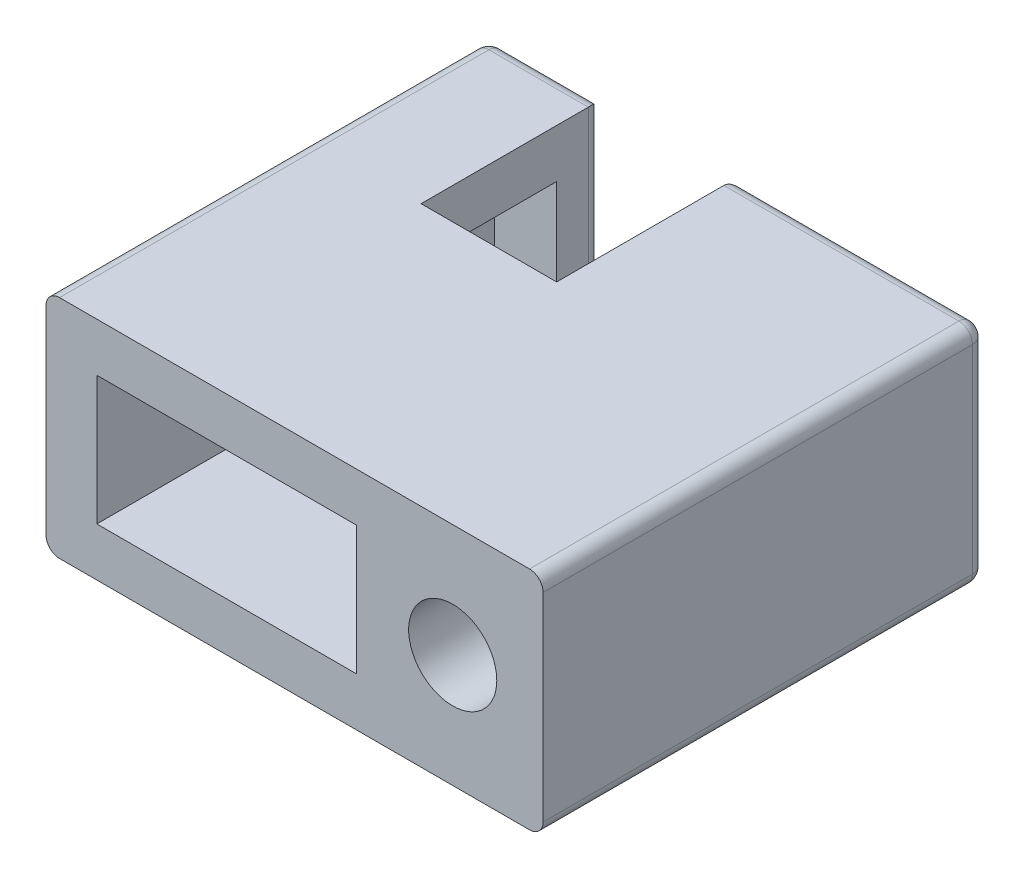
ISO-10303-21;
HEADER;
FILE_DESCRIPTION(('STEP AP214'),'2;1');
FILE_NAME('part.step','',(''),(''),'','','');
FILE_SCHEMA(('AUTOMOTIVE_DESIGN { 1 0 10303 214 1 1 1 1 }'));
ENDSEC;
DATA;
#1=APPLICATION_CONTEXT('core data for automotive mechanical design processes');
#2=APPLICATION_PROTOCOL_DEFINITION('international standard','automotive_design',2000,#1);
#3=PRODUCT_CONTEXT('',#1,'mechanical');
#4=PRODUCT('Part','Part','',(#3));
#5=PRODUCT_RELATED_PRODUCT_CATEGORY('part','',(#4));
#6=PRODUCT_DEFINITION_FORMATION('','',#4);
#7=PRODUCT_DEFINITION_CONTEXT('part definition',#1,'design');
#8=PRODUCT_DEFINITION('design','',#6,#7);
#9=PRODUCT_DEFINITION_SHAPE('','',#8);
#10=(LENGTH_UNIT() NAMED_UNIT(*) SI_UNIT(.MILLI.,.METRE.));
#11=(NAMED_UNIT(*) PLANE_ANGLE_UNIT() SI_UNIT($,.RADIAN.));
#12=(NAMED_UNIT(*) SI_UNIT($,.STERADIAN.) SOLID_ANGLE_UNIT());
#13=UNCERTAINTY_MEASURE_WITH_UNIT(LENGTH_MEASURE(1.E-05),#10,'distance_accuracy_value','');
#14=(GEOMETRIC_REPRESENTATION_CONTEXT(3) GLOBAL_UNCERTAINTY_ASSIGNED_CONTEXT((#13)) GLOBAL_UNIT_ASSIGNED_CONTEXT((#10,
#11,#12)) REPRESENTATION_CONTEXT('',''));
#15=CARTESIAN_POINT('',(0.,0.,0.));
#16=DIRECTION('',(0.,0.,1.));
#17=DIRECTION('',(1.,0.,0.));
#18=AXIS2_PLACEMENT_3D('',#15,#16,#17);
#19=CARTESIAN_POINT('',(1.5,-2.65,-5.8));
#20=DIRECTION('',(0.,0.,1.));
#21=DIRECTION('',(-1.,0.,0.));
#22=AXIS2_PLACEMENT_3D('',#19,#20,#21);
#23=PLANE('',#22);
#24=DIRECTION('',(1.,0.,0.));
#25=VECTOR('',#24,1.);
#26=CARTESIAN_POINT('',(1.5,0.874999999999999,-5.8));
#27=LINE('',#26,#25);
#28=CARTESIAN_POINT('',(-3.7,0.874999999999999,-5.8));
#29=VERTEX_POINT('',#28);
#30=CARTESIAN_POINT('',(-1.8,0.874999999999999,-5.8));
#31=VERTEX_POINT('',#30);
#32=EDGE_CURVE('E330',#29,#31,#27,.T.);
#33=ORIENTED_EDGE('',*,*,#32,.T.);
#34=DIRECTION('',(0.,-1.,0.));
#35=VECTOR('',#34,1.);
#36=CARTESIAN_POINT('',(-1.8,-2.65,-5.8));
#37=LINE('',#36,#35);
#38=CARTESIAN_POINT('',(-1.8,-3.525,-5.8));
#39=VERTEX_POINT('',#38);
#40=EDGE_CURVE('E332',#31,#39,#37,.T.);
#41=ORIENTED_EDGE('',*,*,#40,.T.);
#42=DIRECTION('',(-1.,0.,0.));
#43=VECTOR('',#42,1.);
#44=CARTESIAN_POINT('',(1.5,-3.525,-5.8));
#45=LINE('',#44,#43);
#46=CARTESIAN_POINT('',(-3.7,-3.525,-5.8));
#47=VERTEX_POINT('',#46);
#48=EDGE_CURVE('E326',#39,#47,#45,.T.);
#49=ORIENTED_EDGE('',*,*,#48,.T.);
#50=DIRECTION('',(0.,1.,0.));
#51=VECTOR('',#50,1.);
#52=CARTESIAN_POINT('',(-3.7,-2.65,-5.8));
#53=LINE('',#52,#51);
#54=EDGE_CURVE('E328',#47,#29,#53,.T.);
#55=ORIENTED_EDGE('',*,*,#54,.T.);
#56=EDGE_LOOP('',(#33,#41,#49,#55));
#57=FACE_BOUND('',#56,.T.);
#58=ADVANCED_FACE('F35',(#57),#23,.F.);
#59=CARTESIAN_POINT('',(0.,0.,4.));
#60=DIRECTION('',(0.,0.,1.));
#61=DIRECTION('',(1.,0.,0.));
#62=AXIS2_PLACEMENT_3D('',#59,#60,#61);
#63=PLANE('',#62);
#64=DIRECTION('',(-1.,0.,0.));
#65=VECTOR('',#64,1.);
#66=CARTESIAN_POINT('',(2.875,0.1,4.));
#67=LINE('',#66,#65);
#68=CARTESIAN_POINT('',(2.875,0.1,4.));
#69=VERTEX_POINT('',#68);
#70=CARTESIAN_POINT('',(-2.875,0.099999999999999,4.));
#71=VERTEX_POINT('',#70);
#72=EDGE_CURVE('E236',#69,#71,#67,.T.);
#73=ORIENTED_EDGE('',*,*,#72,.F.);
#74=DIRECTION('',(0.,1.,0.));
#75=VECTOR('',#74,1.);
#76=CARTESIAN_POINT('',(2.875,-2.75,4.));
#77=LINE('',#76,#75);
#78=CARTESIAN_POINT('',(2.875,-2.75,4.));
#79=VERTEX_POINT('',#78);
#80=EDGE_CURVE('E234',#79,#69,#77,.T.);
#81=ORIENTED_EDGE('',*,*,#80,.F.);
#82=DIRECTION('',(1.,0.,0.));
#83=VECTOR('',#82,1.);
#84=CARTESIAN_POINT('',(2.875,-2.75,4.));
#85=LINE('',#84,#83);
#86=CARTESIAN_POINT('',(-2.875,-2.75,4.));
#87=VERTEX_POINT('',#86);
#88=EDGE_CURVE('E241',#87,#79,#85,.T.);
#89=ORIENTED_EDGE('',*,*,#88,.F.);
#90=DIRECTION('',(0.,-1.,0.));
#91=VECTOR('',#90,1.);
#92=CARTESIAN_POINT('',(-2.875,-2.75,4.));
#93=LINE('',#92,#91);
#94=EDGE_CURVE('E238',#71,#87,#93,.T.);
#95=ORIENTED_EDGE('',*,*,#94,.F.);
#96=EDGE_LOOP('',(#73,#81,#89,#95));
#97=FACE_BOUND('',#96,.T.);
#98=DIRECTION('',(0.,1.,0.));
#99=VECTOR('',#98,1.);
#100=CARTESIAN_POINT('',(7.,1.175,4.));
#101=LINE('',#100,#99);
#102=CARTESIAN_POINT('',(7.,-3.525,4.));
#103=VERTEX_POINT('',#102);
#104=CARTESIAN_POINT('',(7.,0.874999999999999,4.));
#105=VERTEX_POINT('',#104);
#106=EDGE_CURVE('E259',#103,#105,#101,.T.);
#107=ORIENTED_EDGE('',*,*,#106,.T.);
#108=CARTESIAN_POINT('',(6.7,0.874999999999999,4.));
#109=DIRECTION('',(0.,0.,1.));
#110=DIRECTION('',(1.,0.,0.));
#111=AXIS2_PLACEMENT_3D('',#108,#109,#110);
#112=CIRCLE('',#111,0.3);
#113=CARTESIAN_POINT('',(6.7,1.175,4.));
#114=VERTEX_POINT('',#113);
#115=EDGE_CURVE('E283',#105,#114,#112,.T.);
#116=ORIENTED_EDGE('',*,*,#115,.T.);
#117=DIRECTION('',(-1.,0.,0.));
#118=VECTOR('',#117,1.);
#119=CARTESIAN_POINT('',(-4.,1.175,4.));
#120=LINE('',#119,#118);
#121=CARTESIAN_POINT('',(-3.7,1.175,4.));
#122=VERTEX_POINT('',#121);
#123=EDGE_CURVE('E262',#114,#122,#120,.T.);
#124=ORIENTED_EDGE('',*,*,#123,.T.);
#125=CARTESIAN_POINT('',(-3.7,0.874999999999999,4.));
#126=DIRECTION('',(0.,0.,1.));
#127=DIRECTION('',(1.,0.,0.));
#128=AXIS2_PLACEMENT_3D('',#125,#126,#127);
#129=CIRCLE('',#128,0.3);
#130=CARTESIAN_POINT('',(-4.,0.874999999999999,4.));
#131=VERTEX_POINT('',#130);
#132=EDGE_CURVE('E277',#122,#131,#129,.T.);
#133=ORIENTED_EDGE('',*,*,#132,.T.);
#134=DIRECTION('',(0.,-1.,0.));
#135=VECTOR('',#134,1.);
#136=CARTESIAN_POINT('',(-4.,1.175,4.));
#137=LINE('',#136,#135);
#138=CARTESIAN_POINT('',(-4.,-3.525,4.));
#139=VERTEX_POINT('',#138);
#140=EDGE_CURVE('E253',#131,#139,#137,.T.);
#141=ORIENTED_EDGE('',*,*,#140,.T.);
#142=CARTESIAN_POINT('',(-3.7,-3.525,4.));
#143=DIRECTION('',(0.,0.,1.));
#144=DIRECTION('',(1.,0.,0.));
#145=AXIS2_PLACEMENT_3D('',#142,#143,#144);
#146=CIRCLE('',#145,0.3);
#147=CARTESIAN_POINT('',(-3.7,-3.825,4.));
#148=VERTEX_POINT('',#147);
#149=EDGE_CURVE('E279',#139,#148,#146,.T.);
#150=ORIENTED_EDGE('',*,*,#149,.T.);
#151=DIRECTION('',(1.,0.,0.));
#152=VECTOR('',#151,1.);
#153=CARTESIAN_POINT('',(-4.,-3.825,4.));
#154=LINE('',#153,#152);
#155=CARTESIAN_POINT('',(6.7,-3.825,4.));
#156=VERTEX_POINT('',#155);
#157=EDGE_CURVE('E256',#148,#156,#154,.T.);
#158=ORIENTED_EDGE('',*,*,#157,.T.);
#159=CARTESIAN_POINT('',(6.7,-3.525,4.));
#160=DIRECTION('',(0.,0.,1.));
#161=DIRECTION('',(1.,0.,0.));
#162=AXIS2_PLACEMENT_3D('',#159,#160,#161);
#163=CIRCLE('',#162,0.3);
#164=EDGE_CURVE('E281',#156,#103,#163,.T.);
#165=ORIENTED_EDGE('',*,*,#164,.T.);
#166=EDGE_LOOP('',(#107,#116,#124,#133,#141,#150,#158,#165));
#167=FACE_BOUND('',#166,.T.);
#168=CARTESIAN_POINT('',(5.,-1.325,4.));
#169=DIRECTION('',(0.,0.,1.));
#170=DIRECTION('',(1.,0.,0.));
#171=AXIS2_PLACEMENT_3D('',#168,#169,#170);
#172=CIRCLE('',#171,0.975);
#173=CARTESIAN_POINT('',(5.975,-1.325,4.));
#174=VERTEX_POINT('',#173);
#175=EDGE_CURVE('E226',#174,#174,#172,.T.);
#176=ORIENTED_EDGE('',*,*,#175,.F.);
#177=EDGE_LOOP('',(#176));
#178=FACE_BOUND('',#177,.T.);
#179=ADVANCED_FACE('F391',(#97,#167,#178),#63,.T.);
#180=CARTESIAN_POINT('',(-4.,1.175,4.));
#181=DIRECTION('',(1.,0.,0.));
#182=DIRECTION('',(0.,0.,-1.));
#183=AXIS2_PLACEMENT_3D('',#180,#181,#182);
#184=PLANE('',#183);
#185=DIRECTION('',(0.,0.,-1.));
#186=VECTOR('',#185,1.);
#187=CARTESIAN_POINT('',(-4.,0.874999999999999,4.));
#188=LINE('',#187,#186);
#189=CARTESIAN_POINT('',(-4.,0.874999999999999,-5.5));
#190=VERTEX_POINT('',#189);
#191=EDGE_CURVE('E290',#131,#190,#188,.T.);
#192=ORIENTED_EDGE('',*,*,#191,.T.);
#193=DIRECTION('',(0.,1.,0.));
#194=VECTOR('',#193,1.);
#195=CARTESIAN_POINT('',(-4.,1.175,-5.5));
#196=LINE('',#195,#194);
#197=CARTESIAN_POINT('',(-4.,-3.525,-5.5));
#198=VERTEX_POINT('',#197);
#199=EDGE_CURVE('E44',#190,#198,#196,.F.);
#200=ORIENTED_EDGE('',*,*,#199,.T.);
#201=DIRECTION('',(0.,0.,-1.));
#202=VECTOR('',#201,1.);
#203=CARTESIAN_POINT('',(-4.,-3.525,4.));
#204=LINE('',#203,#202);
#205=EDGE_CURVE('E292',#198,#139,#204,.F.);
#206=ORIENTED_EDGE('',*,*,#205,.T.);
#207=ORIENTED_EDGE('',*,*,#140,.F.);
#208=EDGE_LOOP('',(#192,#200,#206,#207));
#209=FACE_BOUND('',#208,.T.);
#210=ADVANCED_FACE('F520',(#209),#184,.F.);
#211=CARTESIAN_POINT('',(-4.,-3.825,4.));
#212=DIRECTION('',(0.,1.,0.));
#213=DIRECTION('',(0.,0.,1.));
#214=AXIS2_PLACEMENT_3D('',#211,#212,#213);
#215=PLANE('',#214);
#216=DIRECTION('',(0.,0.,-1.));
#217=VECTOR('',#216,1.);
#218=CARTESIAN_POINT('',(1.5,-3.825,-5.8));
#219=LINE('',#218,#217);
#220=CARTESIAN_POINT('',(1.5,-3.825,-1.8));
#221=VERTEX_POINT('',#220);
#222=CARTESIAN_POINT('',(1.5,-3.825,-5.5));
#223=VERTEX_POINT('',#222);
#224=EDGE_CURVE('E448',#221,#223,#219,.T.);
#225=ORIENTED_EDGE('',*,*,#224,.T.);
#226=DIRECTION('',(-1.,0.,0.));
#227=VECTOR('',#226,1.);
#228=CARTESIAN_POINT('',(-4.,-3.825,-5.5));
#229=LINE('',#228,#227);
#230=CARTESIAN_POINT('',(6.7,-3.825,-5.5));
#231=VERTEX_POINT('',#230);
#232=EDGE_CURVE('E314',#223,#231,#229,.F.);
#233=ORIENTED_EDGE('',*,*,#232,.T.);
#234=DIRECTION('',(0.,0.,-1.));
#235=VECTOR('',#234,1.);
#236=CARTESIAN_POINT('',(6.7,-3.825,4.));
#237=LINE('',#236,#235);
#238=EDGE_CURVE('E288',#231,#156,#237,.F.);
#239=ORIENTED_EDGE('',*,*,#238,.T.);
#240=ORIENTED_EDGE('',*,*,#157,.F.);
#241=DIRECTION('',(0.,0.,-1.));
#242=VECTOR('',#241,1.);
#243=CARTESIAN_POINT('',(-3.7,-3.825,4.));
#244=LINE('',#243,#242);
#245=CARTESIAN_POINT('',(-3.7,-3.825,-5.5));
#246=VERTEX_POINT('',#245);
#247=EDGE_CURVE('E285',#148,#246,#244,.T.);
#248=ORIENTED_EDGE('',*,*,#247,.T.);
#249=DIRECTION('',(-1.,0.,0.));
#250=VECTOR('',#249,1.);
#251=CARTESIAN_POINT('',(-4.,-3.825,-5.5));
#252=LINE('',#251,#250);
#253=CARTESIAN_POINT('',(-1.5,-3.825,-5.5));
#254=VERTEX_POINT('',#253);
#255=EDGE_CURVE('E312',#246,#254,#252,.F.);
#256=ORIENTED_EDGE('',*,*,#255,.T.);
#257=DIRECTION('',(0.,0.,1.));
#258=VECTOR('',#257,1.);
#259=CARTESIAN_POINT('',(-1.5,-3.825,-5.8));
#260=LINE('',#259,#258);
#261=CARTESIAN_POINT('',(-1.5,-3.825,-1.8));
#262=VERTEX_POINT('',#261);
#263=EDGE_CURVE('E442',#254,#262,#260,.T.);
#264=ORIENTED_EDGE('',*,*,#263,.T.);
#265=DIRECTION('',(1.,0.,0.));
#266=VECTOR('',#265,1.);
#267=CARTESIAN_POINT('',(-1.5,-3.825,-1.8));
#268=LINE('',#267,#266);
#269=EDGE_CURVE('E450',#262,#221,#268,.T.);
#270=ORIENTED_EDGE('',*,*,#269,.T.);
#271=EDGE_LOOP('',(#225,#233,#239,#240,#248,#256,#264,#270));
#272=FACE_BOUND('',#271,.T.);
#273=ADVANCED_FACE('F387',(#272),#215,.F.);
#274=CARTESIAN_POINT('',(7.,1.175,4.));
#275=DIRECTION('',(-1.,0.,0.));
#276=DIRECTION('',(0.,0.,1.));
#277=AXIS2_PLACEMENT_3D('',#274,#275,#276);
#278=PLANE('',#277);
#279=DIRECTION('',(0.,0.,-1.));
#280=VECTOR('',#279,1.);
#281=CARTESIAN_POINT('',(7.,-3.525,4.));
#282=LINE('',#281,#280);
#283=CARTESIAN_POINT('',(7.,-3.525,-5.5));
#284=VERTEX_POINT('',#283);
#285=EDGE_CURVE('E272',#103,#284,#282,.T.);
#286=ORIENTED_EDGE('',*,*,#285,.T.);
#287=DIRECTION('',(0.,-1.,0.));
#288=VECTOR('',#287,1.);
#289=CARTESIAN_POINT('',(7.,1.175,-5.5));
#290=LINE('',#289,#288);
#291=CARTESIAN_POINT('',(7.,0.874999999999999,-5.5));
#292=VERTEX_POINT('',#291);
#293=EDGE_CURVE('E318',#284,#292,#290,.F.);
#294=ORIENTED_EDGE('',*,*,#293,.T.);
#295=DIRECTION('',(0.,0.,-1.));
#296=VECTOR('',#295,1.);
#297=CARTESIAN_POINT('',(7.,0.874999999999999,4.));
#298=LINE('',#297,#296);
#299=EDGE_CURVE('E275',#292,#105,#298,.F.);
#300=ORIENTED_EDGE('',*,*,#299,.T.);
#301=ORIENTED_EDGE('',*,*,#106,.F.);
#302=EDGE_LOOP('',(#286,#294,#300,#301));
#303=FACE_BOUND('',#302,.T.);
#304=ADVANCED_FACE('F400',(#303),#278,.F.);
#305=CARTESIAN_POINT('',(-4.,1.175,4.));
#306=DIRECTION('',(0.,-1.,0.));
#307=DIRECTION('',(0.,0.,-1.));
#308=AXIS2_PLACEMENT_3D('',#305,#306,#307);
#309=PLANE('',#308);
#310=DIRECTION('',(0.,0.,-1.));
#311=VECTOR('',#310,1.);
#312=CARTESIAN_POINT('',(6.7,1.175,4.));
#313=LINE('',#312,#311);
#314=CARTESIAN_POINT('',(6.7,1.175,-5.5));
#315=VERTEX_POINT('',#314);
#316=EDGE_CURVE('E269',#114,#315,#313,.T.);
#317=ORIENTED_EDGE('',*,*,#316,.T.);
#318=DIRECTION('',(1.,0.,0.));
#319=VECTOR('',#318,1.);
#320=CARTESIAN_POINT('',(-4.,1.175,-5.5));
#321=LINE('',#320,#319);
#322=CARTESIAN_POINT('',(1.5,1.175,-5.5));
#323=VERTEX_POINT('',#322);
#324=EDGE_CURVE('E324',#315,#323,#321,.F.);
#325=ORIENTED_EDGE('',*,*,#324,.T.);
#326=DIRECTION('',(0.,0.,-1.));
#327=VECTOR('',#326,1.);
#328=CARTESIAN_POINT('',(1.5,1.175,-5.8));
#329=LINE('',#328,#327);
#330=CARTESIAN_POINT('',(1.5,1.175,-1.8));
#331=VERTEX_POINT('',#330);
#332=EDGE_CURVE('E432',#331,#323,#329,.T.);
#333=ORIENTED_EDGE('',*,*,#332,.F.);
#334=DIRECTION('',(1.,0.,0.));
#335=VECTOR('',#334,1.);
#336=CARTESIAN_POINT('',(-1.5,1.175,-1.8));
#337=LINE('',#336,#335);
#338=CARTESIAN_POINT('',(-1.5,1.175,-1.8));
#339=VERTEX_POINT('',#338);
#340=EDGE_CURVE('E443',#339,#331,#337,.T.);
#341=ORIENTED_EDGE('',*,*,#340,.F.);
#342=DIRECTION('',(0.,0.,1.));
#343=VECTOR('',#342,1.);
#344=CARTESIAN_POINT('',(-1.5,1.175,-5.8));
#345=LINE('',#344,#343);
#346=CARTESIAN_POINT('',(-1.5,1.175,-5.5));
#347=VERTEX_POINT('',#346);
#348=EDGE_CURVE('E470',#347,#339,#345,.T.);
#349=ORIENTED_EDGE('',*,*,#348,.F.);
#350=DIRECTION('',(1.,0.,0.));
#351=VECTOR('',#350,1.);
#352=CARTESIAN_POINT('',(-4.,1.175,-5.5));
#353=LINE('',#352,#351);
#354=CARTESIAN_POINT('',(-3.7,1.175,-5.5));
#355=VERTEX_POINT('',#354);
#356=EDGE_CURVE('E322',#347,#355,#353,.F.);
#357=ORIENTED_EDGE('',*,*,#356,.T.);
#358=DIRECTION('',(0.,0.,-1.));
#359=VECTOR('',#358,1.);
#360=CARTESIAN_POINT('',(-3.7,1.175,4.));
#361=LINE('',#360,#359);
#362=EDGE_CURVE('E267',#355,#122,#361,.F.);
#363=ORIENTED_EDGE('',*,*,#362,.T.);
#364=ORIENTED_EDGE('',*,*,#123,.F.);
#365=EDGE_LOOP('',(#317,#325,#333,#341,#349,#357,#363,#364));
#366=FACE_BOUND('',#365,.T.);
#367=ADVANCED_FACE('F430',(#366),#309,.F.);
#368=CARTESIAN_POINT('',(2.875,-2.75,4.));
#369=DIRECTION('',(-1.,0.,0.));
#370=DIRECTION('',(0.,0.,1.));
#371=AXIS2_PLACEMENT_3D('',#368,#369,#370);
#372=PLANE('',#371);
#373=DIRECTION('',(0.,-1.,0.));
#374=VECTOR('',#373,1.);
#375=CARTESIAN_POINT('',(2.875,0.1,-4.8));
#376=LINE('',#375,#374);
#377=CARTESIAN_POINT('',(2.875,0.1,-4.8));
#378=VERTEX_POINT('',#377);
#379=CARTESIAN_POINT('',(2.875,-2.75,-4.8));
#380=VERTEX_POINT('',#379);
#381=EDGE_CURVE('E472',#378,#380,#376,.T.);
#382=ORIENTED_EDGE('',*,*,#381,.T.);
#383=DIRECTION('',(0.,0.,-1.));
#384=VECTOR('',#383,1.);
#385=CARTESIAN_POINT('',(2.875,-2.75,4.));
#386=LINE('',#385,#384);
#387=EDGE_CURVE('E243',#79,#380,#386,.T.);
#388=ORIENTED_EDGE('',*,*,#387,.F.);
#389=ORIENTED_EDGE('',*,*,#80,.T.);
#390=DIRECTION('',(0.,0.,-1.));
#391=VECTOR('',#390,1.);
#392=CARTESIAN_POINT('',(2.875,0.1,4.));
#393=LINE('',#392,#391);
#394=EDGE_CURVE('E250',#69,#378,#393,.T.);
#395=ORIENTED_EDGE('',*,*,#394,.T.);
#396=EDGE_LOOP('',(#382,#388,#389,#395));
#397=FACE_BOUND('',#396,.T.);
#398=ADVANCED_FACE('F498',(#397),#372,.T.);
#399=CARTESIAN_POINT('',(2.875,0.1,4.));
#400=DIRECTION('',(0.,-1.,0.));
#401=DIRECTION('',(1.,0.,0.));
#402=AXIS2_PLACEMENT_3D('',#399,#400,#401);
#403=PLANE('',#402);
#404=DIRECTION('',(1.,0.,0.));
#405=VECTOR('',#404,1.);
#406=CARTESIAN_POINT('',(-2.875,0.099999999999999,-4.8));
#407=LINE('',#406,#405);
#408=CARTESIAN_POINT('',(-2.875,0.099999999999999,-4.8));
#409=VERTEX_POINT('',#408);
#410=CARTESIAN_POINT('',(-1.5,0.099999999999999,-4.8));
#411=VERTEX_POINT('',#410);
#412=EDGE_CURVE('E200',#409,#411,#407,.T.);
#413=ORIENTED_EDGE('',*,*,#412,.T.);
#414=DIRECTION('',(0.,0.,-1.));
#415=VECTOR('',#414,1.);
#416=CARTESIAN_POINT('',(-1.5,0.0999999999999992,4.));
#417=LINE('',#416,#415);
#418=CARTESIAN_POINT('',(-1.5,0.0999999999999994,-1.8));
#419=VERTEX_POINT('',#418);
#420=EDGE_CURVE('E213',#419,#411,#417,.T.);
#421=ORIENTED_EDGE('',*,*,#420,.F.);
#422=DIRECTION('',(-1.,0.,0.));
#423=VECTOR('',#422,1.);
#424=CARTESIAN_POINT('',(2.875,0.1,-1.8));
#425=LINE('',#424,#423);
#426=CARTESIAN_POINT('',(1.5,0.0999999999999994,-1.8));
#427=VERTEX_POINT('',#426);
#428=EDGE_CURVE('E223',#427,#419,#425,.T.);
#429=ORIENTED_EDGE('',*,*,#428,.F.);
#430=DIRECTION('',(0.,0.,1.));
#431=VECTOR('',#430,1.);
#432=CARTESIAN_POINT('',(1.5,0.0999999999999998,4.));
#433=LINE('',#432,#431);
#434=CARTESIAN_POINT('',(1.5,0.1,-4.8));
#435=VERTEX_POINT('',#434);
#436=EDGE_CURVE('E228',#435,#427,#433,.T.);
#437=ORIENTED_EDGE('',*,*,#436,.F.);
#438=DIRECTION('',(1.,0.,0.));
#439=VECTOR('',#438,1.);
#440=CARTESIAN_POINT('',(2.875,0.1,-4.8));
#441=LINE('',#440,#439);
#442=EDGE_CURVE('E490',#435,#378,#441,.T.);
#443=ORIENTED_EDGE('',*,*,#442,.T.);
#444=ORIENTED_EDGE('',*,*,#394,.F.);
#445=ORIENTED_EDGE('',*,*,#72,.T.);
#446=DIRECTION('',(0.,0.,-1.));
#447=VECTOR('',#446,1.);
#448=CARTESIAN_POINT('',(-2.875,0.099999999999999,4.));
#449=LINE('',#448,#447);
#450=EDGE_CURVE('E215',#71,#409,#449,.T.);
#451=ORIENTED_EDGE('',*,*,#450,.T.);
#452=EDGE_LOOP('',(#413,#421,#429,#437,#443,#444,#445,#451));
#453=FACE_BOUND('',#452,.T.);
#454=ADVANCED_FACE('F211',(#453),#403,.T.);
#455=CARTESIAN_POINT('',(-2.875,-2.75,4.));
#456=DIRECTION('',(1.,0.,0.));
#457=DIRECTION('',(0.,0.,-1.));
#458=AXIS2_PLACEMENT_3D('',#455,#456,#457);
#459=PLANE('',#458);
#460=DIRECTION('',(0.,1.,0.));
#461=VECTOR('',#460,1.);
#462=CARTESIAN_POINT('',(-2.875,0.099999999999999,-4.8));
#463=LINE('',#462,#461);
#464=CARTESIAN_POINT('',(-2.875,-2.75,-4.8));
#465=VERTEX_POINT('',#464);
#466=EDGE_CURVE('E488',#465,#409,#463,.T.);
#467=ORIENTED_EDGE('',*,*,#466,.T.);
#468=ORIENTED_EDGE('',*,*,#450,.F.);
#469=ORIENTED_EDGE('',*,*,#94,.T.);
#470=DIRECTION('',(0.,0.,-1.));
#471=VECTOR('',#470,1.);
#472=CARTESIAN_POINT('',(-2.875,-2.75,4.));
#473=LINE('',#472,#471);
#474=EDGE_CURVE('E246',#87,#465,#473,.T.);
#475=ORIENTED_EDGE('',*,*,#474,.T.);
#476=EDGE_LOOP('',(#467,#468,#469,#475));
#477=FACE_BOUND('',#476,.T.);
#478=ADVANCED_FACE('F504',(#477),#459,.T.);
#479=CARTESIAN_POINT('',(2.875,-2.75,4.));
#480=DIRECTION('',(0.,1.,0.));
#481=DIRECTION('',(-1.,0.,0.));
#482=AXIS2_PLACEMENT_3D('',#479,#480,#481);
#483=PLANE('',#482);
#484=DIRECTION('',(-1.,0.,0.));
#485=VECTOR('',#484,1.);
#486=CARTESIAN_POINT('',(-2.875,-2.75,-4.8));
#487=LINE('',#486,#485);
#488=CARTESIAN_POINT('',(-1.5,-2.75,-4.8));
#489=VERTEX_POINT('',#488);
#490=EDGE_CURVE('E203',#489,#465,#487,.T.);
#491=ORIENTED_EDGE('',*,*,#490,.T.);
#492=ORIENTED_EDGE('',*,*,#474,.F.);
#493=ORIENTED_EDGE('',*,*,#88,.T.);
#494=ORIENTED_EDGE('',*,*,#387,.T.);
#495=DIRECTION('',(-1.,0.,0.));
#496=VECTOR('',#495,1.);
#497=CARTESIAN_POINT('',(2.875,-2.75,-4.8));
#498=LINE('',#497,#496);
#499=CARTESIAN_POINT('',(1.5,-2.75,-4.8));
#500=VERTEX_POINT('',#499);
#501=EDGE_CURVE('E484',#380,#500,#498,.T.);
#502=ORIENTED_EDGE('',*,*,#501,.T.);
#503=DIRECTION('',(0.,0.,-1.));
#504=VECTOR('',#503,1.);
#505=CARTESIAN_POINT('',(1.5,-2.75,4.));
#506=LINE('',#505,#504);
#507=CARTESIAN_POINT('',(1.5,-2.75,-1.8));
#508=VERTEX_POINT('',#507);
#509=EDGE_CURVE('E459',#508,#500,#506,.T.);
#510=ORIENTED_EDGE('',*,*,#509,.F.);
#511=DIRECTION('',(1.,0.,0.));
#512=VECTOR('',#511,1.);
#513=CARTESIAN_POINT('',(2.875,-2.75,-1.8));
#514=LINE('',#513,#512);
#515=CARTESIAN_POINT('',(-1.5,-2.75,-1.8));
#516=VERTEX_POINT('',#515);
#517=EDGE_CURVE('E265',#516,#508,#514,.T.);
#518=ORIENTED_EDGE('',*,*,#517,.F.);
#519=DIRECTION('',(0.,0.,1.));
#520=VECTOR('',#519,1.);
#521=CARTESIAN_POINT('',(-1.5,-2.75,4.));
#522=LINE('',#521,#520);
#523=EDGE_CURVE('E224',#489,#516,#522,.T.);
#524=ORIENTED_EDGE('',*,*,#523,.F.);
#525=EDGE_LOOP('',(#491,#492,#493,#494,#502,#510,#518,#524));
#526=FACE_BOUND('',#525,.T.);
#527=ADVANCED_FACE('F483',(#526),#483,.T.);
#528=CARTESIAN_POINT('',(5.,-1.325,4.));
#529=DIRECTION('',(0.,0.,-1.));
#530=DIRECTION('',(-1.,0.,0.));
#531=AXIS2_PLACEMENT_3D('',#528,#529,#530);
#532=CYLINDRICAL_SURFACE('',#531,0.975);
#533=CARTESIAN_POINT('',(5.,-1.325,-5.5));
#534=DIRECTION('',(0.,0.,1.));
#535=DIRECTION('',(1.,0.,0.));
#536=AXIS2_PLACEMENT_3D('',#533,#534,#535);
#537=CIRCLE('',#536,0.975);
#538=CARTESIAN_POINT('',(5.975,-1.325,-5.5));
#539=VERTEX_POINT('',#538);
#540=EDGE_CURVE('E294',#539,#539,#537,.F.);
#541=ORIENTED_EDGE('',*,*,#540,.T.);
#542=EDGE_LOOP('',(#541));
#543=FACE_BOUND('',#542,.T.);
#544=ORIENTED_EDGE('',*,*,#175,.T.);
#545=EDGE_LOOP('',(#544));
#546=FACE_BOUND('',#545,.T.);
#547=ADVANCED_FACE('F511',(#543,#546),#532,.F.);
#548=CARTESIAN_POINT('',(5.,-1.325,-5.8));
#549=DIRECTION('',(0.,0.,1.));
#550=DIRECTION('',(1.,0.,0.));
#551=AXIS2_PLACEMENT_3D('',#548,#549,#550);
#552=CIRCLE('',#551,1.275);
#553=CARTESIAN_POINT('',(6.275,-1.325,-5.8));
#554=VERTEX_POINT('',#553);
#555=EDGE_CURVE('E306',#554,#554,#552,.T.);
#556=ORIENTED_EDGE('',*,*,#555,.T.);
#557=EDGE_LOOP('',(#556));
#558=FACE_BOUND('',#557,.T.);
#559=DIRECTION('',(-1.,0.,0.));
#560=VECTOR('',#559,1.);
#561=CARTESIAN_POINT('',(1.5,-3.525,-5.8));
#562=LINE('',#561,#560);
#563=CARTESIAN_POINT('',(6.7,-3.525,-5.8));
#564=VERTEX_POINT('',#563);
#565=CARTESIAN_POINT('',(1.8,-3.525,-5.8));
#566=VERTEX_POINT('',#565);
#567=EDGE_CURVE('E301',#564,#566,#562,.T.);
#568=ORIENTED_EDGE('',*,*,#567,.T.);
#569=DIRECTION('',(0.,1.,0.));
#570=VECTOR('',#569,1.);
#571=CARTESIAN_POINT('',(1.8,-2.65,-5.8));
#572=LINE('',#571,#570);
#573=CARTESIAN_POINT('',(1.8,0.874999999999999,-5.8));
#574=VERTEX_POINT('',#573);
#575=EDGE_CURVE('E303',#566,#574,#572,.T.);
#576=ORIENTED_EDGE('',*,*,#575,.T.);
#577=DIRECTION('',(1.,0.,0.));
#578=VECTOR('',#577,1.);
#579=CARTESIAN_POINT('',(1.5,0.874999999999999,-5.8));
#580=LINE('',#579,#578);
#581=CARTESIAN_POINT('',(6.7,0.874999999999999,-5.8));
#582=VERTEX_POINT('',#581);
#583=EDGE_CURVE('E297',#574,#582,#580,.T.);
#584=ORIENTED_EDGE('',*,*,#583,.T.);
#585=DIRECTION('',(0.,-1.,0.));
#586=VECTOR('',#585,1.);
#587=CARTESIAN_POINT('',(6.7,-2.65,-5.8));
#588=LINE('',#587,#586);
#589=EDGE_CURVE('E299',#582,#564,#588,.T.);
#590=ORIENTED_EDGE('',*,*,#589,.T.);
#591=EDGE_LOOP('',(#568,#576,#584,#590));
#592=FACE_BOUND('',#591,.T.);
#593=ADVANCED_FACE('F418',(#558,#592),#23,.F.);
#594=CARTESIAN_POINT('',(-1.5,-3.825,-5.8));
#595=DIRECTION('',(-1.,0.,0.));
#596=DIRECTION('',(0.,-1.,0.));
#597=AXIS2_PLACEMENT_3D('',#594,#595,#596);
#598=PLANE('',#597);
#599=ORIENTED_EDGE('',*,*,#263,.F.);
#600=DIRECTION('',(0.,-1.,0.));
#601=VECTOR('',#600,1.);
#602=CARTESIAN_POINT('',(-1.5,-3.825,-5.5));
#603=LINE('',#602,#601);
#604=EDGE_CURVE('E335',#254,#347,#603,.F.);
#605=ORIENTED_EDGE('',*,*,#604,.T.);
#606=ORIENTED_EDGE('',*,*,#348,.T.);
#607=DIRECTION('',(0.,1.,0.));
#608=VECTOR('',#607,1.);
#609=CARTESIAN_POINT('',(-1.5,-3.825,-1.8));
#610=LINE('',#609,#608);
#611=EDGE_CURVE('E222',#419,#339,#610,.T.);
#612=ORIENTED_EDGE('',*,*,#611,.F.);
#613=ORIENTED_EDGE('',*,*,#420,.T.);
#614=DIRECTION('',(0.,-1.,0.));
#615=VECTOR('',#614,1.);
#616=CARTESIAN_POINT('',(-1.5,0.099999999999999,-4.8));
#617=LINE('',#616,#615);
#618=EDGE_CURVE('E197',#411,#489,#617,.T.);
#619=ORIENTED_EDGE('',*,*,#618,.T.);
#620=ORIENTED_EDGE('',*,*,#523,.T.);
#621=EDGE_CURVE('E453',#262,#516,#610,.T.);
#622=ORIENTED_EDGE('',*,*,#621,.F.);
#623=EDGE_LOOP('',(#599,#605,#606,#612,#613,#619,#620,#622));
#624=FACE_BOUND('',#623,.T.);
#625=ADVANCED_FACE('F220',(#624),#598,.F.);
#626=CARTESIAN_POINT('',(1.5,-3.825,-5.8));
#627=DIRECTION('',(1.,0.,0.));
#628=DIRECTION('',(0.,1.,0.));
#629=AXIS2_PLACEMENT_3D('',#626,#627,#628);
#630=PLANE('',#629);
#631=ORIENTED_EDGE('',*,*,#332,.T.);
#632=DIRECTION('',(0.,1.,0.));
#633=VECTOR('',#632,1.);
#634=CARTESIAN_POINT('',(1.5,-3.825,-5.5));
#635=LINE('',#634,#633);
#636=EDGE_CURVE('E309',#323,#223,#635,.F.);
#637=ORIENTED_EDGE('',*,*,#636,.T.);
#638=ORIENTED_EDGE('',*,*,#224,.F.);
#639=DIRECTION('',(0.,1.,0.));
#640=VECTOR('',#639,1.);
#641=CARTESIAN_POINT('',(1.5,-3.825,-1.8));
#642=LINE('',#641,#640);
#643=EDGE_CURVE('E458',#221,#508,#642,.T.);
#644=ORIENTED_EDGE('',*,*,#643,.T.);
#645=ORIENTED_EDGE('',*,*,#509,.T.);
#646=DIRECTION('',(0.,1.,0.));
#647=VECTOR('',#646,1.);
#648=CARTESIAN_POINT('',(1.5,0.1,-4.8));
#649=LINE('',#648,#647);
#650=EDGE_CURVE('E465',#500,#435,#649,.T.);
#651=ORIENTED_EDGE('',*,*,#650,.T.);
#652=ORIENTED_EDGE('',*,*,#436,.T.);
#653=EDGE_CURVE('E440',#427,#331,#642,.T.);
#654=ORIENTED_EDGE('',*,*,#653,.T.);
#655=EDGE_LOOP('',(#631,#637,#638,#644,#645,#651,#652,#654));
#656=FACE_BOUND('',#655,.T.);
#657=ADVANCED_FACE('F437',(#656),#630,.F.);
#658=CARTESIAN_POINT('',(-1.5,-3.825,-1.8));
#659=DIRECTION('',(0.,0.,1.));
#660=DIRECTION('',(1.,0.,0.));
#661=AXIS2_PLACEMENT_3D('',#658,#659,#660);
#662=PLANE('',#661);
#663=ORIENTED_EDGE('',*,*,#428,.T.);
#664=ORIENTED_EDGE('',*,*,#611,.T.);
#665=ORIENTED_EDGE('',*,*,#340,.T.);
#666=ORIENTED_EDGE('',*,*,#653,.F.);
#667=EDGE_LOOP('',(#663,#664,#665,#666));
#668=FACE_BOUND('',#667,.T.);
#669=ADVANCED_FACE('F468',(#668),#662,.F.);
#670=ORIENTED_EDGE('',*,*,#517,.T.);
#671=ORIENTED_EDGE('',*,*,#643,.F.);
#672=ORIENTED_EDGE('',*,*,#269,.F.);
#673=ORIENTED_EDGE('',*,*,#621,.T.);
#674=EDGE_LOOP('',(#670,#671,#672,#673));
#675=FACE_BOUND('',#674,.T.);
#676=ADVANCED_FACE('F479',(#675),#662,.F.);
#677=CARTESIAN_POINT('',(-1.5,-2.65,-4.8));
#678=DIRECTION('',(0.,0.,1.));
#679=DIRECTION('',(0.,1.,0.));
#680=AXIS2_PLACEMENT_3D('',#677,#678,#679);
#681=PLANE('',#680);
#682=ORIENTED_EDGE('',*,*,#381,.F.);
#683=ORIENTED_EDGE('',*,*,#442,.F.);
#684=ORIENTED_EDGE('',*,*,#650,.F.);
#685=ORIENTED_EDGE('',*,*,#501,.F.);
#686=EDGE_LOOP('',(#682,#683,#684,#685));
#687=FACE_BOUND('',#686,.T.);
#688=ADVANCED_FACE('F721',(#687),#681,.T.);
#689=CARTESIAN_POINT('',(-1.5,-2.65,-4.8));
#690=DIRECTION('',(0.,0.,1.));
#691=DIRECTION('',(0.,1.,0.));
#692=AXIS2_PLACEMENT_3D('',#689,#690,#691);
#693=PLANE('',#692);
#694=ORIENTED_EDGE('',*,*,#466,.F.);
#695=ORIENTED_EDGE('',*,*,#490,.F.);
#696=ORIENTED_EDGE('',*,*,#618,.F.);
#697=ORIENTED_EDGE('',*,*,#412,.F.);
#698=EDGE_LOOP('',(#694,#695,#696,#697));
#699=FACE_BOUND('',#698,.T.);
#700=ADVANCED_FACE('F199',(#699),#693,.T.);
#701=CARTESIAN_POINT('',(6.7,0.874999999999999,4.));
#702=DIRECTION('',(0.,0.,-1.));
#703=DIRECTION('',(-1.,0.,0.));
#704=AXIS2_PLACEMENT_3D('',#701,#702,#703);
#705=CYLINDRICAL_SURFACE('',#704,0.3);
#706=ORIENTED_EDGE('',*,*,#299,.F.);
#707=CARTESIAN_POINT('',(6.7,0.874999999999999,-5.5));
#708=DIRECTION('',(0.,0.,-1.));
#709=DIRECTION('',(-1.,0.,0.));
#710=AXIS2_PLACEMENT_3D('',#707,#708,#709);
#711=CIRCLE('',#710,0.3);
#712=EDGE_CURVE('E320',#292,#315,#711,.F.);
#713=ORIENTED_EDGE('',*,*,#712,.T.);
#714=ORIENTED_EDGE('',*,*,#316,.F.);
#715=ORIENTED_EDGE('',*,*,#115,.F.);
#716=EDGE_LOOP('',(#706,#713,#714,#715));
#717=FACE_BOUND('',#716,.T.);
#718=ADVANCED_FACE('F628',(#717),#705,.T.);
#719=CARTESIAN_POINT('',(6.7,-3.525,4.));
#720=DIRECTION('',(0.,0.,-1.));
#721=DIRECTION('',(-1.,0.,0.));
#722=AXIS2_PLACEMENT_3D('',#719,#720,#721);
#723=CYLINDRICAL_SURFACE('',#722,0.3);
#724=ORIENTED_EDGE('',*,*,#238,.F.);
#725=CARTESIAN_POINT('',(6.7,-3.525,-5.5));
#726=DIRECTION('',(0.,0.,-1.));
#727=DIRECTION('',(-1.,0.,0.));
#728=AXIS2_PLACEMENT_3D('',#725,#726,#727);
#729=CIRCLE('',#728,0.3);
#730=EDGE_CURVE('E316',#231,#284,#729,.F.);
#731=ORIENTED_EDGE('',*,*,#730,.T.);
#732=ORIENTED_EDGE('',*,*,#285,.F.);
#733=ORIENTED_EDGE('',*,*,#164,.F.);
#734=EDGE_LOOP('',(#724,#731,#732,#733));
#735=FACE_BOUND('',#734,.T.);
#736=ADVANCED_FACE('F396',(#735),#723,.T.);
#737=CARTESIAN_POINT('',(-3.7,-3.525,4.));
#738=DIRECTION('',(0.,0.,-1.));
#739=DIRECTION('',(-1.,0.,0.));
#740=AXIS2_PLACEMENT_3D('',#737,#738,#739);
#741=CYLINDRICAL_SURFACE('',#740,0.3);
#742=ORIENTED_EDGE('',*,*,#205,.F.);
#743=CARTESIAN_POINT('',(-3.7,-3.525,-5.5));
#744=DIRECTION('',(0.,0.,-1.));
#745=DIRECTION('',(-1.,0.,0.));
#746=AXIS2_PLACEMENT_3D('',#743,#744,#745);
#747=CIRCLE('',#746,0.3);
#748=EDGE_CURVE('E11',#198,#246,#747,.F.);
#749=ORIENTED_EDGE('',*,*,#748,.T.);
#750=ORIENTED_EDGE('',*,*,#247,.F.);
#751=ORIENTED_EDGE('',*,*,#149,.F.);
#752=EDGE_LOOP('',(#742,#749,#750,#751));
#753=FACE_BOUND('',#752,.T.);
#754=ADVANCED_FACE('F382',(#753),#741,.T.);
#755=CARTESIAN_POINT('',(-3.7,0.874999999999999,4.));
#756=DIRECTION('',(0.,0.,-1.));
#757=DIRECTION('',(-1.,0.,0.));
#758=AXIS2_PLACEMENT_3D('',#755,#756,#757);
#759=CYLINDRICAL_SURFACE('',#758,0.3);
#760=ORIENTED_EDGE('',*,*,#362,.F.);
#761=CARTESIAN_POINT('',(-3.7,0.874999999999999,-5.5));
#762=DIRECTION('',(0.,0.,-1.));
#763=DIRECTION('',(-1.,0.,0.));
#764=AXIS2_PLACEMENT_3D('',#761,#762,#763);
#765=CIRCLE('',#764,0.3);
#766=EDGE_CURVE('E59',#355,#190,#765,.F.);
#767=ORIENTED_EDGE('',*,*,#766,.T.);
#768=ORIENTED_EDGE('',*,*,#191,.F.);
#769=ORIENTED_EDGE('',*,*,#132,.F.);
#770=EDGE_LOOP('',(#760,#767,#768,#769));
#771=FACE_BOUND('',#770,.T.);
#772=ADVANCED_FACE('F536',(#771),#759,.T.);
#773=CARTESIAN_POINT('',(5.,-1.325,-5.5));
#774=DIRECTION('',(0.,0.,1.));
#775=DIRECTION('',(1.,0.,0.));
#776=AXIS2_PLACEMENT_3D('',#773,#774,#775);
#777=TOROIDAL_SURFACE('',#776,1.275,0.3);
#778=ORIENTED_EDGE('',*,*,#555,.F.);
#779=EDGE_LOOP('',(#778));
#780=FACE_BOUND('',#779,.T.);
#781=ORIENTED_EDGE('',*,*,#540,.F.);
#782=EDGE_LOOP('',(#781));
#783=FACE_BOUND('',#782,.T.);
#784=ADVANCED_FACE('F533',(#780,#783),#777,.T.);
#785=CARTESIAN_POINT('',(6.7,-2.65,-5.5));
#786=DIRECTION('',(0.,-1.,0.));
#787=DIRECTION('',(0.,0.,-1.));
#788=AXIS2_PLACEMENT_3D('',#785,#786,#787);
#789=CYLINDRICAL_SURFACE('',#788,0.3);
#790=CARTESIAN_POINT('',(6.7,0.874999999999999,-5.5));
#791=DIRECTION('',(0.,1.,0.));
#792=DIRECTION('',(0.,0.,1.));
#793=AXIS2_PLACEMENT_3D('',#790,#791,#792);
#794=CIRCLE('',#793,0.3);
#795=EDGE_CURVE('E350',#292,#582,#794,.T.);
#796=ORIENTED_EDGE('',*,*,#795,.F.);
#797=ORIENTED_EDGE('',*,*,#293,.F.);
#798=CARTESIAN_POINT('',(6.7,-3.525,-5.5));
#799=DIRECTION('',(0.,-1.,0.));
#800=DIRECTION('',(0.,0.,-1.));
#801=AXIS2_PLACEMENT_3D('',#798,#799,#800);
#802=CIRCLE('',#801,0.3);
#803=EDGE_CURVE('E216',#564,#284,#802,.T.);
#804=ORIENTED_EDGE('',*,*,#803,.F.);
#805=ORIENTED_EDGE('',*,*,#589,.F.);
#806=EDGE_LOOP('',(#796,#797,#804,#805));
#807=FACE_BOUND('',#806,.T.);
#808=ADVANCED_FACE('F405',(#807),#789,.T.);
#809=CARTESIAN_POINT('',(6.7,-3.525,-5.5));
#810=DIRECTION('',(0.,0.,1.));
#811=DIRECTION('',(1.,0.,0.));
#812=AXIS2_PLACEMENT_3D('',#809,#810,#811);
#813=SPHERICAL_SURFACE('',#812,0.3);
#814=ORIENTED_EDGE('',*,*,#803,.T.);
#815=ORIENTED_EDGE('',*,*,#730,.F.);
#816=CARTESIAN_POINT('',(6.7,-3.525,-5.5));
#817=DIRECTION('',(-1.,0.,0.));
#818=DIRECTION('',(0.,0.,1.));
#819=AXIS2_PLACEMENT_3D('',#816,#817,#818);
#820=CIRCLE('',#819,0.3);
#821=EDGE_CURVE('E347',#564,#231,#820,.T.);
#822=ORIENTED_EDGE('',*,*,#821,.F.);
#823=EDGE_LOOP('',(#814,#815,#822));
#824=FACE_BOUND('',#823,.T.);
#825=ADVANCED_FACE('F410',(#824),#813,.T.);
#826=CARTESIAN_POINT('',(6.7,0.874999999999999,-5.5));
#827=DIRECTION('',(0.,0.,1.));
#828=DIRECTION('',(1.,0.,0.));
#829=AXIS2_PLACEMENT_3D('',#826,#827,#828);
#830=SPHERICAL_SURFACE('',#829,0.3);
#831=ORIENTED_EDGE('',*,*,#712,.F.);
#832=ORIENTED_EDGE('',*,*,#795,.T.);
#833=CARTESIAN_POINT('',(6.7,0.874999999999999,-5.5));
#834=DIRECTION('',(-1.,0.,0.));
#835=DIRECTION('',(0.,0.,1.));
#836=AXIS2_PLACEMENT_3D('',#833,#834,#835);
#837=CIRCLE('',#836,0.3);
#838=EDGE_CURVE('E344',#315,#582,#837,.T.);
#839=ORIENTED_EDGE('',*,*,#838,.F.);
#840=EDGE_LOOP('',(#831,#832,#839));
#841=FACE_BOUND('',#840,.T.);
#842=ADVANCED_FACE('F422',(#841),#830,.T.);
#843=CARTESIAN_POINT('',(1.5,-3.525,-5.5));
#844=DIRECTION('',(-1.,0.,0.));
#845=DIRECTION('',(0.,0.,1.));
#846=AXIS2_PLACEMENT_3D('',#843,#844,#845);
#847=CYLINDRICAL_SURFACE('',#846,0.3);
#848=ORIENTED_EDGE('',*,*,#821,.T.);
#849=ORIENTED_EDGE('',*,*,#232,.F.);
#850=CARTESIAN_POINT('',(1.8,-3.525,-5.5));
#851=DIRECTION('',(-0.707106781186548,0.707106781186547,0.));
#852=DIRECTION('',(-0.707106781186547,-0.707106781186548,0.));
#853=AXIS2_PLACEMENT_3D('',#850,#851,#852);
#854=ELLIPSE('',#853,0.424264068711928,0.3);
#855=EDGE_CURVE('E342',#566,#223,#854,.T.);
#856=ORIENTED_EDGE('',*,*,#855,.F.);
#857=ORIENTED_EDGE('',*,*,#567,.F.);
#858=EDGE_LOOP('',(#848,#849,#856,#857));
#859=FACE_BOUND('',#858,.T.);
#860=ADVANCED_FACE('F415',(#859),#847,.T.);
#861=CARTESIAN_POINT('',(1.5,0.874999999999999,-5.5));
#862=DIRECTION('',(1.,0.,0.));
#863=DIRECTION('',(0.,0.,-1.));
#864=AXIS2_PLACEMENT_3D('',#861,#862,#863);
#865=CYLINDRICAL_SURFACE('',#864,0.3);
#866=ORIENTED_EDGE('',*,*,#838,.T.);
#867=ORIENTED_EDGE('',*,*,#583,.F.);
#868=CARTESIAN_POINT('',(1.8,0.874999999999999,-5.5));
#869=DIRECTION('',(0.707106781186547,0.707106781186548,0.));
#870=DIRECTION('',(0.707106781186548,-0.707106781186547,0.));
#871=AXIS2_PLACEMENT_3D('',#868,#869,#870);
#872=ELLIPSE('',#871,0.424264068711929,0.3);
#873=EDGE_CURVE('E340',#323,#574,#872,.F.);
#874=ORIENTED_EDGE('',*,*,#873,.F.);
#875=ORIENTED_EDGE('',*,*,#324,.F.);
#876=EDGE_LOOP('',(#866,#867,#874,#875));
#877=FACE_BOUND('',#876,.T.);
#878=ADVANCED_FACE('F425',(#877),#865,.T.);
#879=CARTESIAN_POINT('',(1.8,-2.65,-5.5));
#880=DIRECTION('',(0.,1.,0.));
#881=DIRECTION('',(-1.,0.,0.));
#882=AXIS2_PLACEMENT_3D('',#879,#880,#881);
#883=CYLINDRICAL_SURFACE('',#882,0.3);
#884=ORIENTED_EDGE('',*,*,#855,.T.);
#885=ORIENTED_EDGE('',*,*,#636,.F.);
#886=ORIENTED_EDGE('',*,*,#873,.T.);
#887=ORIENTED_EDGE('',*,*,#575,.F.);
#888=EDGE_LOOP('',(#884,#885,#886,#887));
#889=FACE_BOUND('',#888,.T.);
#890=ADVANCED_FACE('F446',(#889),#883,.T.);
#891=CARTESIAN_POINT('',(-3.7,-2.65,-5.5));
#892=DIRECTION('',(0.,1.,0.));
#893=DIRECTION('',(0.,0.,1.));
#894=AXIS2_PLACEMENT_3D('',#891,#892,#893);
#895=CYLINDRICAL_SURFACE('',#894,0.3);
#896=CARTESIAN_POINT('',(-3.7,-3.525,-5.5));
#897=DIRECTION('',(0.,-1.,0.));
#898=DIRECTION('',(0.,0.,-1.));
#899=AXIS2_PLACEMENT_3D('',#896,#897,#898);
#900=CIRCLE('',#899,0.3);
#901=EDGE_CURVE('E364',#198,#47,#900,.T.);
#902=ORIENTED_EDGE('',*,*,#901,.F.);
#903=ORIENTED_EDGE('',*,*,#199,.F.);
#904=CARTESIAN_POINT('',(-3.7,0.874999999999999,-5.5));
#905=DIRECTION('',(0.,1.,0.));
#906=DIRECTION('',(0.,0.,1.));
#907=AXIS2_PLACEMENT_3D('',#904,#905,#906);
#908=CIRCLE('',#907,0.3);
#909=EDGE_CURVE('E39',#29,#190,#908,.T.);
#910=ORIENTED_EDGE('',*,*,#909,.F.);
#911=ORIENTED_EDGE('',*,*,#54,.F.);
#912=EDGE_LOOP('',(#902,#903,#910,#911));
#913=FACE_BOUND('',#912,.T.);
#914=ADVANCED_FACE('F37',(#913),#895,.T.);
#915=CARTESIAN_POINT('',(-3.7,0.874999999999999,-5.5));
#916=DIRECTION('',(0.,0.,1.));
#917=DIRECTION('',(1.,0.,0.));
#918=AXIS2_PLACEMENT_3D('',#915,#916,#917);
#919=SPHERICAL_SURFACE('',#918,0.3);
#920=ORIENTED_EDGE('',*,*,#909,.T.);
#921=ORIENTED_EDGE('',*,*,#766,.F.);
#922=CARTESIAN_POINT('',(-3.7,0.874999999999999,-5.5));
#923=DIRECTION('',(1.,0.,0.));
#924=DIRECTION('',(0.,0.,-1.));
#925=AXIS2_PLACEMENT_3D('',#922,#923,#924);
#926=CIRCLE('',#925,0.3);
#927=EDGE_CURVE('E362',#29,#355,#926,.T.);
#928=ORIENTED_EDGE('',*,*,#927,.F.);
#929=EDGE_LOOP('',(#920,#921,#928));
#930=FACE_BOUND('',#929,.T.);
#931=ADVANCED_FACE('F374',(#930),#919,.T.);
#932=CARTESIAN_POINT('',(-3.7,-3.525,-5.5));
#933=DIRECTION('',(0.,0.,1.));
#934=DIRECTION('',(1.,0.,0.));
#935=AXIS2_PLACEMENT_3D('',#932,#933,#934);
#936=SPHERICAL_SURFACE('',#935,0.3);
#937=ORIENTED_EDGE('',*,*,#748,.F.);
#938=ORIENTED_EDGE('',*,*,#901,.T.);
#939=CARTESIAN_POINT('',(-3.7,-3.525,-5.5));
#940=DIRECTION('',(1.,0.,0.));
#941=DIRECTION('',(0.,0.,-1.));
#942=AXIS2_PLACEMENT_3D('',#939,#940,#941);
#943=CIRCLE('',#942,0.3);
#944=EDGE_CURVE('E359',#246,#47,#943,.T.);
#945=ORIENTED_EDGE('',*,*,#944,.F.);
#946=EDGE_LOOP('',(#937,#938,#945));
#947=FACE_BOUND('',#946,.T.);
#948=ADVANCED_FACE('F378',(#947),#936,.T.);
#949=CARTESIAN_POINT('',(1.5,0.874999999999999,-5.5));
#950=DIRECTION('',(1.,0.,0.));
#951=DIRECTION('',(0.,0.,-1.));
#952=AXIS2_PLACEMENT_3D('',#949,#950,#951);
#953=CYLINDRICAL_SURFACE('',#952,0.3);
#954=ORIENTED_EDGE('',*,*,#927,.T.);
#955=ORIENTED_EDGE('',*,*,#356,.F.);
#956=CARTESIAN_POINT('',(-1.8,0.874999999999999,-5.5));
#957=DIRECTION('',(0.707106781186548,-0.707106781186547,0.));
#958=DIRECTION('',(0.707106781186547,0.707106781186548,0.));
#959=AXIS2_PLACEMENT_3D('',#956,#957,#958);
#960=ELLIPSE('',#959,0.424264068711928,0.3);
#961=EDGE_CURVE('E357',#31,#347,#960,.T.);
#962=ORIENTED_EDGE('',*,*,#961,.F.);
#963=ORIENTED_EDGE('',*,*,#32,.F.);
#964=EDGE_LOOP('',(#954,#955,#962,#963));
#965=FACE_BOUND('',#964,.T.);
#966=ADVANCED_FACE('F566',(#965),#953,.T.);
#967=CARTESIAN_POINT('',(1.5,-3.525,-5.5));
#968=DIRECTION('',(-1.,0.,0.));
#969=DIRECTION('',(0.,0.,1.));
#970=AXIS2_PLACEMENT_3D('',#967,#968,#969);
#971=CYLINDRICAL_SURFACE('',#970,0.3);
#972=ORIENTED_EDGE('',*,*,#944,.T.);
#973=ORIENTED_EDGE('',*,*,#48,.F.);
#974=CARTESIAN_POINT('',(-1.8,-3.525,-5.5));
#975=DIRECTION('',(-0.707106781186547,-0.707106781186548,0.));
#976=DIRECTION('',(-0.707106781186548,0.707106781186547,0.));
#977=AXIS2_PLACEMENT_3D('',#974,#975,#976);
#978=ELLIPSE('',#977,0.424264068711929,0.3);
#979=EDGE_CURVE('E355',#254,#39,#978,.F.);
#980=ORIENTED_EDGE('',*,*,#979,.F.);
#981=ORIENTED_EDGE('',*,*,#255,.F.);
#982=EDGE_LOOP('',(#972,#973,#980,#981));
#983=FACE_BOUND('',#982,.T.);
#984=ADVANCED_FACE('F562',(#983),#971,.T.);
#985=CARTESIAN_POINT('',(-1.8,-2.65,-5.5));
#986=DIRECTION('',(0.,-1.,0.));
#987=DIRECTION('',(1.,0.,0.));
#988=AXIS2_PLACEMENT_3D('',#985,#986,#987);
#989=CYLINDRICAL_SURFACE('',#988,0.3);
#990=ORIENTED_EDGE('',*,*,#961,.T.);
#991=ORIENTED_EDGE('',*,*,#604,.F.);
#992=ORIENTED_EDGE('',*,*,#979,.T.);
#993=ORIENTED_EDGE('',*,*,#40,.F.);
#994=EDGE_LOOP('',(#990,#991,#992,#993));
#995=FACE_BOUND('',#994,.T.);
#996=ADVANCED_FACE('F559',(#995),#989,.T.);
#997=CLOSED_SHELL('',(#58,#179,#210,#273,#304,#367,#398,#454,#478,#527,#547,#593,#625,#657,#669,
#676,#688,#700,#718,#736,#754,#772,#784,#808,#825,#842,#860,#878,#890,#914,#931,#948,#966,#984,#996));
#998=MANIFOLD_SOLID_BREP('B2',#997);
#999=ADVANCED_BREP_SHAPE_REPRESENTATION('',(#18,#998),#14);
#1000=SHAPE_DEFINITION_REPRESENTATION(#9,#999);
ENDSEC;
END-ISO-10303-21;
